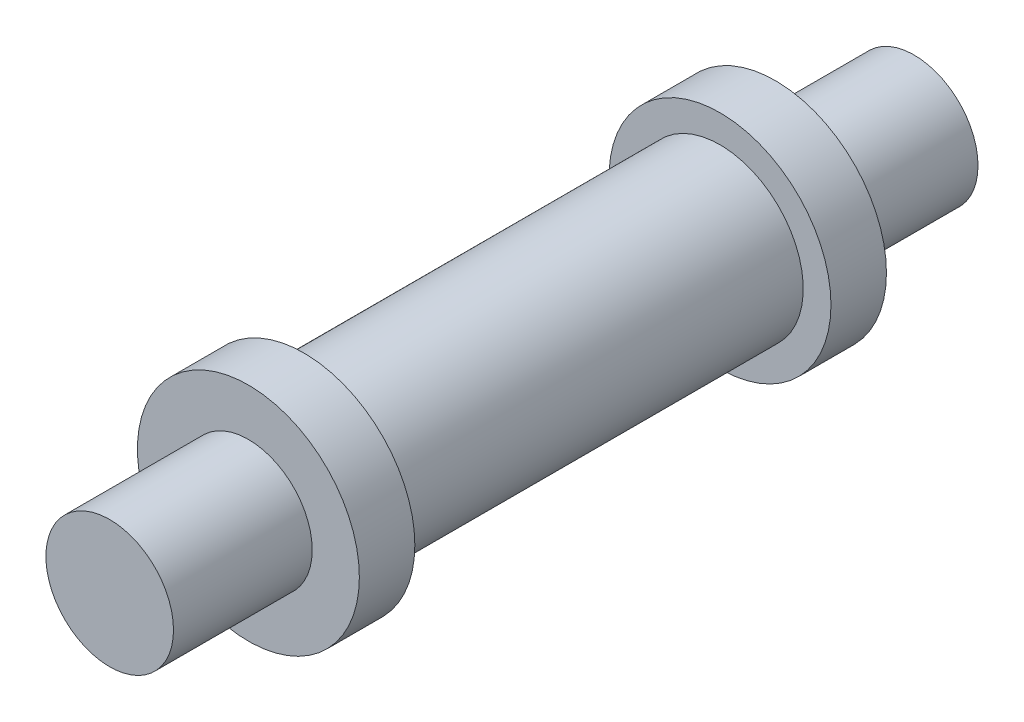
ISO-10303-21;
HEADER;
FILE_DESCRIPTION(('STEP AP214'),'2;1');
FILE_NAME('part.step','',(''),(''),'','','');
FILE_SCHEMA(('AUTOMOTIVE_DESIGN { 1 0 10303 214 1 1 1 1 }'));
ENDSEC;
DATA;
#1=APPLICATION_CONTEXT('core data for automotive mechanical design processes');
#2=APPLICATION_PROTOCOL_DEFINITION('international standard','automotive_design',2000,#1);
#3=PRODUCT_CONTEXT('',#1,'mechanical');
#4=PRODUCT('Part','Part','',(#3));
#5=PRODUCT_RELATED_PRODUCT_CATEGORY('part','',(#4));
#6=PRODUCT_DEFINITION_FORMATION('','',#4);
#7=PRODUCT_DEFINITION_CONTEXT('part definition',#1,'design');
#8=PRODUCT_DEFINITION('design','',#6,#7);
#9=PRODUCT_DEFINITION_SHAPE('','',#8);
#10=(LENGTH_UNIT() NAMED_UNIT(*) SI_UNIT(.MILLI.,.METRE.));
#11=(NAMED_UNIT(*) PLANE_ANGLE_UNIT() SI_UNIT($,.RADIAN.));
#12=(NAMED_UNIT(*) SI_UNIT($,.STERADIAN.) SOLID_ANGLE_UNIT());
#13=UNCERTAINTY_MEASURE_WITH_UNIT(LENGTH_MEASURE(1.E-05),#10,'distance_accuracy_value','');
#14=(GEOMETRIC_REPRESENTATION_CONTEXT(3) GLOBAL_UNCERTAINTY_ASSIGNED_CONTEXT((#13)) GLOBAL_UNIT_ASSIGNED_CONTEXT((#10,
#11,#12)) REPRESENTATION_CONTEXT('',''));
#15=CARTESIAN_POINT('',(0.,0.,0.));
#16=DIRECTION('',(0.,0.,1.));
#17=DIRECTION('',(1.,0.,0.));
#18=AXIS2_PLACEMENT_3D('',#15,#16,#17);
#19=CARTESIAN_POINT('',(0.,0.,6.35));
#20=DIRECTION('',(0.,0.,-1.));
#21=DIRECTION('',(-1.,0.,0.));
#22=AXIS2_PLACEMENT_3D('',#19,#20,#21);
#23=CYLINDRICAL_SURFACE('',#22,2.921);
#24=CARTESIAN_POINT('',(0.,0.,6.35));
#25=DIRECTION('',(0.,0.,1.));
#26=DIRECTION('',(1.,0.,0.));
#27=AXIS2_PLACEMENT_3D('',#24,#25,#26);
#28=CIRCLE('',#27,2.921);
#29=CARTESIAN_POINT('',(2.921,0.,6.35));
#30=VERTEX_POINT('',#29);
#31=EDGE_CURVE('E57',#30,#30,#28,.T.);
#32=ORIENTED_EDGE('',*,*,#31,.F.);
#33=EDGE_LOOP('',(#32));
#34=FACE_BOUND('',#33,.T.);
#35=CARTESIAN_POINT('',(0.,0.,0.));
#36=DIRECTION('',(0.,0.,1.));
#37=DIRECTION('',(1.,0.,0.));
#38=AXIS2_PLACEMENT_3D('',#35,#36,#37);
#39=CIRCLE('',#38,2.921);
#40=CARTESIAN_POINT('',(2.921,0.,0.));
#41=VERTEX_POINT('',#40);
#42=EDGE_CURVE('E46',#41,#41,#39,.T.);
#43=ORIENTED_EDGE('',*,*,#42,.T.);
#44=EDGE_LOOP('',(#43));
#45=FACE_BOUND('',#44,.T.);
#46=ADVANCED_FACE('F43',(#34,#45),#23,.T.);
#47=CARTESIAN_POINT('',(0.,0.,0.));
#48=DIRECTION('',(0.,0.,1.));
#49=DIRECTION('',(1.,0.,0.));
#50=AXIS2_PLACEMENT_3D('',#47,#48,#49);
#51=PLANE('',#50);
#52=ORIENTED_EDGE('',*,*,#42,.F.);
#53=EDGE_LOOP('',(#52));
#54=FACE_BOUND('',#53,.T.);
#55=ADVANCED_FACE('F90',(#54),#51,.F.);
#56=CARTESIAN_POINT('',(0.,0.,8.89));
#57=DIRECTION('',(0.,0.,-1.));
#58=DIRECTION('',(-1.,0.,0.));
#59=AXIS2_PLACEMENT_3D('',#56,#57,#58);
#60=CYLINDRICAL_SURFACE('',#59,5.08);
#61=CARTESIAN_POINT('',(0.,0.,8.89));
#62=DIRECTION('',(0.,0.,1.));
#63=DIRECTION('',(1.,0.,0.));
#64=AXIS2_PLACEMENT_3D('',#61,#62,#63);
#65=CIRCLE('',#64,5.08);
#66=CARTESIAN_POINT('',(5.08,0.,8.89));
#67=VERTEX_POINT('',#66);
#68=EDGE_CURVE('E75',#67,#67,#65,.T.);
#69=ORIENTED_EDGE('',*,*,#68,.F.);
#70=EDGE_LOOP('',(#69));
#71=FACE_BOUND('',#70,.T.);
#72=CARTESIAN_POINT('',(0.,0.,6.35));
#73=DIRECTION('',(0.,0.,1.));
#74=DIRECTION('',(1.,0.,0.));
#75=AXIS2_PLACEMENT_3D('',#72,#73,#74);
#76=CIRCLE('',#75,5.08);
#77=CARTESIAN_POINT('',(5.08,0.,6.35));
#78=VERTEX_POINT('',#77);
#79=EDGE_CURVE('E73',#78,#78,#76,.T.);
#80=ORIENTED_EDGE('',*,*,#79,.T.);
#81=EDGE_LOOP('',(#80));
#82=FACE_BOUND('',#81,.T.);
#83=ADVANCED_FACE('F92',(#71,#82),#60,.T.);
#84=CARTESIAN_POINT('',(0.,0.,8.89));
#85=DIRECTION('',(0.,0.,1.));
#86=DIRECTION('',(1.,0.,0.));
#87=AXIS2_PLACEMENT_3D('',#84,#85,#86);
#88=PLANE('',#87);
#89=CARTESIAN_POINT('',(0.,0.,8.89));
#90=DIRECTION('',(0.,0.,1.));
#91=DIRECTION('',(1.,0.,0.));
#92=AXIS2_PLACEMENT_3D('',#89,#90,#91);
#93=CIRCLE('',#92,3.81);
#94=CARTESIAN_POINT('',(-3.81,0.,8.89));
#95=VERTEX_POINT('',#94);
#96=EDGE_CURVE('E51',#95,#95,#93,.T.);
#97=ORIENTED_EDGE('',*,*,#96,.F.);
#98=EDGE_LOOP('',(#97));
#99=FACE_BOUND('',#98,.T.);
#100=ORIENTED_EDGE('',*,*,#68,.T.);
#101=EDGE_LOOP('',(#100));
#102=FACE_BOUND('',#101,.T.);
#103=ADVANCED_FACE('F97',(#99,#102),#88,.T.);
#104=CARTESIAN_POINT('',(0.,0.,6.35));
#105=DIRECTION('',(0.,0.,1.));
#106=DIRECTION('',(1.,0.,0.));
#107=AXIS2_PLACEMENT_3D('',#104,#105,#106);
#108=PLANE('',#107);
#109=ORIENTED_EDGE('',*,*,#31,.T.);
#110=EDGE_LOOP('',(#109));
#111=FACE_BOUND('',#110,.T.);
#112=ORIENTED_EDGE('',*,*,#79,.F.);
#113=EDGE_LOOP('',(#112));
#114=FACE_BOUND('',#113,.T.);
#115=ADVANCED_FACE('F102',(#111,#114),#108,.F.);
#116=CARTESIAN_POINT('',(0.,0.,27.94));
#117=DIRECTION('',(0.,0.,-1.));
#118=DIRECTION('',(-1.,0.,0.));
#119=AXIS2_PLACEMENT_3D('',#116,#117,#118);
#120=CYLINDRICAL_SURFACE('',#119,3.81);
#121=CARTESIAN_POINT('',(0.,0.,27.94));
#122=DIRECTION('',(0.,0.,1.));
#123=DIRECTION('',(1.,0.,0.));
#124=AXIS2_PLACEMENT_3D('',#121,#122,#123);
#125=CIRCLE('',#124,3.81);
#126=CARTESIAN_POINT('',(-3.81,0.,27.94));
#127=VERTEX_POINT('',#126);
#128=EDGE_CURVE('E66',#127,#127,#125,.T.);
#129=CARTESIAN_POINT('',(-3.81,0.,27.94));
#130=CARTESIAN_POINT('',(-3.81,0.,27.7415625));
#131=CARTESIAN_POINT('',(-3.81,0.,27.543125));
#132=CARTESIAN_POINT('',(-3.81,0.,27.14625));
#133=CARTESIAN_POINT('',(-3.81,0.,26.9478125));
#134=CARTESIAN_POINT('',(-3.81,0.,26.5509375));
#135=CARTESIAN_POINT('',(-3.81,0.,26.3525));
#136=CARTESIAN_POINT('',(-3.81,0.,25.955625));
#137=CARTESIAN_POINT('',(-3.81,0.,25.7571875));
#138=CARTESIAN_POINT('',(-3.81,0.,25.3603125));
#139=CARTESIAN_POINT('',(-3.81,0.,25.161875));
#140=CARTESIAN_POINT('',(-3.81,0.,24.765));
#141=CARTESIAN_POINT('',(-3.81,0.,24.5665625));
#142=CARTESIAN_POINT('',(-3.81,0.,24.1696875));
#143=CARTESIAN_POINT('',(-3.81,0.,23.97125));
#144=CARTESIAN_POINT('',(-3.81,0.,23.574375));
#145=CARTESIAN_POINT('',(-3.81,0.,23.3759375));
#146=CARTESIAN_POINT('',(-3.81,0.,22.9790625));
#147=CARTESIAN_POINT('',(-3.81,0.,22.780625));
#148=CARTESIAN_POINT('',(-3.81,0.,22.38375));
#149=CARTESIAN_POINT('',(-3.81,0.,22.1853125));
#150=CARTESIAN_POINT('',(-3.81,0.,21.7884375));
#151=CARTESIAN_POINT('',(-3.81,0.,21.59));
#152=CARTESIAN_POINT('',(-3.81,0.,21.193125));
#153=CARTESIAN_POINT('',(-3.81,0.,20.9946875));
#154=CARTESIAN_POINT('',(-3.81,0.,20.5978125));
#155=CARTESIAN_POINT('',(-3.81,0.,20.399375));
#156=CARTESIAN_POINT('',(-3.81,0.,20.0025));
#157=CARTESIAN_POINT('',(-3.81,0.,19.8040625));
#158=CARTESIAN_POINT('',(-3.81,0.,19.4071875));
#159=CARTESIAN_POINT('',(-3.81,0.,19.20875));
#160=CARTESIAN_POINT('',(-3.81,0.,18.811875));
#161=CARTESIAN_POINT('',(-3.81,0.,18.6134375));
#162=CARTESIAN_POINT('',(-3.81,0.,18.2165625));
#163=CARTESIAN_POINT('',(-3.81,0.,18.018125));
#164=CARTESIAN_POINT('',(-3.81,0.,17.62125));
#165=CARTESIAN_POINT('',(-3.81,0.,17.4228125));
#166=CARTESIAN_POINT('',(-3.81,0.,17.0259375));
#167=CARTESIAN_POINT('',(-3.81,0.,16.8275));
#168=CARTESIAN_POINT('',(-3.81,0.,16.430625));
#169=CARTESIAN_POINT('',(-3.81,0.,16.2321875));
#170=CARTESIAN_POINT('',(-3.81,0.,15.8353125));
#171=CARTESIAN_POINT('',(-3.81,0.,15.636875));
#172=CARTESIAN_POINT('',(-3.81,0.,15.24));
#173=CARTESIAN_POINT('',(-3.81,0.,15.0415625));
#174=CARTESIAN_POINT('',(-3.81,0.,14.6446875));
#175=CARTESIAN_POINT('',(-3.81,0.,14.44625));
#176=CARTESIAN_POINT('',(-3.81,0.,14.049375));
#177=CARTESIAN_POINT('',(-3.81,0.,13.8509375));
#178=CARTESIAN_POINT('',(-3.81,0.,13.4540625));
#179=CARTESIAN_POINT('',(-3.81,0.,13.255625));
#180=CARTESIAN_POINT('',(-3.81,0.,12.85875));
#181=CARTESIAN_POINT('',(-3.81,0.,12.6603125));
#182=CARTESIAN_POINT('',(-3.81,0.,12.2634375));
#183=CARTESIAN_POINT('',(-3.81,0.,12.065));
#184=CARTESIAN_POINT('',(-3.81,0.,11.668125));
#185=CARTESIAN_POINT('',(-3.81,0.,11.4696875));
#186=CARTESIAN_POINT('',(-3.81,0.,11.0728125));
#187=CARTESIAN_POINT('',(-3.81,0.,10.874375));
#188=CARTESIAN_POINT('',(-3.81,0.,10.4775));
#189=CARTESIAN_POINT('',(-3.81,0.,10.2790625));
#190=CARTESIAN_POINT('',(-3.81,0.,9.8821875));
#191=CARTESIAN_POINT('',(-3.81,0.,9.68375));
#192=CARTESIAN_POINT('',(-3.81,0.,9.286875));
#193=CARTESIAN_POINT('',(-3.81,0.,9.0884375));
#194=CARTESIAN_POINT('',(-3.81,0.,8.89));
#195=B_SPLINE_CURVE_WITH_KNOTS('',3,(#129,#130,#131,#132,#133,#134,#135,#136,#137,#138,#139,
#140,#141,#142,#143,#144,#145,#146,#147,#148,#149,#150,#151,#152,#153,#154,#155,#156,#157,#158,
#159,#160,#161,#162,#163,#164,#165,#166,#167,#168,#169,#170,#171,#172,#173,#174,#175,#176,#177,
#178,#179,#180,#181,#182,#183,#184,#185,#186,#187,#188,#189,#190,#191,#192,#193,#194),
.UNSPECIFIED.,.F.,.F.,(4,2,2,2,2,2,2,2,2,2,2,2,2,2,2,2,2,2,2,2,2,2,2,2,2,2,2,2,2,2,2,2,4),(0.,
0.5953125,1.190625,1.7859375,2.38125,2.9765625,3.571875,4.1671875,4.7625,5.3578125,5.953125,
6.5484375,7.14375,7.7390625,8.334375,8.9296875,9.525,10.1203125,10.715625,11.3109375,11.90625,
12.5015625,13.096875,13.6921875,14.2875,14.8828125,15.478125,16.0734375,16.66875,17.2640625,
17.859375,18.4546875,19.05),.UNSPECIFIED.);
#196=EDGE_CURVE('BSEAM105',#127,#95,#195,.T.);
#197=ORIENTED_EDGE('',*,*,#128,.F.);
#198=ORIENTED_EDGE('',*,*,#96,.T.);
#199=ORIENTED_EDGE('',*,*,#196,.T.);
#200=ORIENTED_EDGE('',*,*,#196,.F.);
#201=EDGE_LOOP('',(#197,#199,#198,#200));
#202=FACE_BOUND('',#201,.T.);
#203=ADVANCED_FACE('F105',(#202),#120,.T.);
#204=CARTESIAN_POINT('',(0.,0.,30.48));
#205=DIRECTION('',(0.,0.,-1.));
#206=DIRECTION('',(-1.,0.,0.));
#207=AXIS2_PLACEMENT_3D('',#204,#205,#206);
#208=CYLINDRICAL_SURFACE('',#207,5.08);
#209=CARTESIAN_POINT('',(0.,0.,30.48));
#210=DIRECTION('',(0.,0.,1.));
#211=DIRECTION('',(1.,0.,0.));
#212=AXIS2_PLACEMENT_3D('',#209,#210,#211);
#213=CIRCLE('',#212,5.08);
#214=CARTESIAN_POINT('',(5.08,0.,30.48));
#215=VERTEX_POINT('',#214);
#216=EDGE_CURVE('E62',#215,#215,#213,.T.);
#217=ORIENTED_EDGE('',*,*,#216,.F.);
#218=EDGE_LOOP('',(#217));
#219=FACE_BOUND('',#218,.T.);
#220=CARTESIAN_POINT('',(0.,0.,27.94));
#221=DIRECTION('',(0.,0.,1.));
#222=DIRECTION('',(1.,0.,0.));
#223=AXIS2_PLACEMENT_3D('',#220,#221,#222);
#224=CIRCLE('',#223,5.08);
#225=CARTESIAN_POINT('',(5.08,0.,27.94));
#226=VERTEX_POINT('',#225);
#227=EDGE_CURVE('E67',#226,#226,#224,.T.);
#228=ORIENTED_EDGE('',*,*,#227,.T.);
#229=EDGE_LOOP('',(#228));
#230=FACE_BOUND('',#229,.T.);
#231=ADVANCED_FACE('F111',(#219,#230),#208,.T.);
#232=CARTESIAN_POINT('',(0.,0.,30.48));
#233=DIRECTION('',(0.,0.,1.));
#234=DIRECTION('',(1.,0.,0.));
#235=AXIS2_PLACEMENT_3D('',#232,#233,#234);
#236=PLANE('',#235);
#237=CARTESIAN_POINT('',(0.,0.,30.48));
#238=DIRECTION('',(0.,0.,1.));
#239=DIRECTION('',(1.,0.,0.));
#240=AXIS2_PLACEMENT_3D('',#237,#238,#239);
#241=CIRCLE('',#240,2.921);
#242=CARTESIAN_POINT('',(2.921,0.,30.48));
#243=VERTEX_POINT('',#242);
#244=EDGE_CURVE('E10',#243,#243,#241,.T.);
#245=ORIENTED_EDGE('',*,*,#244,.F.);
#246=EDGE_LOOP('',(#245));
#247=FACE_BOUND('',#246,.T.);
#248=ORIENTED_EDGE('',*,*,#216,.T.);
#249=EDGE_LOOP('',(#248));
#250=FACE_BOUND('',#249,.T.);
#251=ADVANCED_FACE('F115',(#247,#250),#236,.T.);
#252=CARTESIAN_POINT('',(0.,0.,27.94));
#253=DIRECTION('',(0.,0.,1.));
#254=DIRECTION('',(1.,0.,0.));
#255=AXIS2_PLACEMENT_3D('',#252,#253,#254);
#256=PLANE('',#255);
#257=ORIENTED_EDGE('',*,*,#128,.T.);
#258=EDGE_LOOP('',(#257));
#259=FACE_BOUND('',#258,.T.);
#260=ORIENTED_EDGE('',*,*,#227,.F.);
#261=EDGE_LOOP('',(#260));
#262=FACE_BOUND('',#261,.T.);
#263=ADVANCED_FACE('F117',(#259,#262),#256,.F.);
#264=CARTESIAN_POINT('',(0.,0.,36.83));
#265=DIRECTION('',(0.,0.,-1.));
#266=DIRECTION('',(-1.,0.,0.));
#267=AXIS2_PLACEMENT_3D('',#264,#265,#266);
#268=CYLINDRICAL_SURFACE('',#267,2.921);
#269=CARTESIAN_POINT('',(0.,0.,36.83));
#270=DIRECTION('',(0.,0.,1.));
#271=DIRECTION('',(1.,0.,0.));
#272=AXIS2_PLACEMENT_3D('',#269,#270,#271);
#273=CIRCLE('',#272,2.921);
#274=CARTESIAN_POINT('',(2.921,0.,36.83));
#275=VERTEX_POINT('',#274);
#276=EDGE_CURVE('E61',#275,#275,#273,.T.);
#277=ORIENTED_EDGE('',*,*,#276,.F.);
#278=EDGE_LOOP('',(#277));
#279=FACE_BOUND('',#278,.T.);
#280=ORIENTED_EDGE('',*,*,#244,.T.);
#281=EDGE_LOOP('',(#280));
#282=FACE_BOUND('',#281,.T.);
#283=ADVANCED_FACE('F120',(#279,#282),#268,.T.);
#284=CARTESIAN_POINT('',(0.,0.,36.83));
#285=DIRECTION('',(0.,0.,1.));
#286=DIRECTION('',(1.,0.,0.));
#287=AXIS2_PLACEMENT_3D('',#284,#285,#286);
#288=PLANE('',#287);
#289=ORIENTED_EDGE('',*,*,#276,.T.);
#290=EDGE_LOOP('',(#289));
#291=FACE_BOUND('',#290,.T.);
#292=ADVANCED_FACE('F127',(#291),#288,.T.);
#293=CLOSED_SHELL('',(#46,#55,#83,#103,#115,#203,#231,#251,#263,#283,#292));
#294=MANIFOLD_SOLID_BREP('B2',#293);
#295=ADVANCED_BREP_SHAPE_REPRESENTATION('',(#18,#294),#14);
#296=SHAPE_DEFINITION_REPRESENTATION(#9,#295);
ENDSEC;
END-ISO-10303-21;
